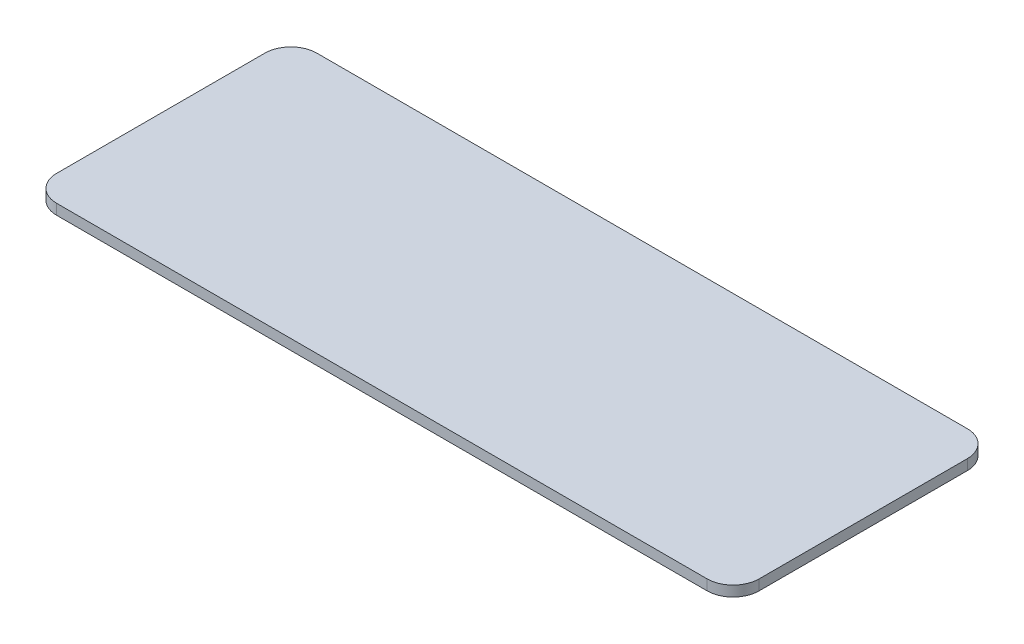
ISO-10303-21;
HEADER;
FILE_DESCRIPTION(('STEP AP214'),'2;1');
FILE_NAME('part.step','',(''),(''),'','','');
FILE_SCHEMA(('AUTOMOTIVE_DESIGN { 1 0 10303 214 1 1 1 1 }'));
ENDSEC;
DATA;
#1=APPLICATION_CONTEXT('core data for automotive mechanical design processes');
#2=APPLICATION_PROTOCOL_DEFINITION('international standard','automotive_design',2000,#1);
#3=PRODUCT_CONTEXT('',#1,'mechanical');
#4=PRODUCT('Part','Part','',(#3));
#5=PRODUCT_RELATED_PRODUCT_CATEGORY('part','',(#4));
#6=PRODUCT_DEFINITION_FORMATION('','',#4);
#7=PRODUCT_DEFINITION_CONTEXT('part definition',#1,'design');
#8=PRODUCT_DEFINITION('design','',#6,#7);
#9=PRODUCT_DEFINITION_SHAPE('','',#8);
#10=(LENGTH_UNIT() NAMED_UNIT(*) SI_UNIT(.MILLI.,.METRE.));
#11=(NAMED_UNIT(*) PLANE_ANGLE_UNIT() SI_UNIT($,.RADIAN.));
#12=(NAMED_UNIT(*) SI_UNIT($,.STERADIAN.) SOLID_ANGLE_UNIT());
#13=UNCERTAINTY_MEASURE_WITH_UNIT(LENGTH_MEASURE(1.E-05),#10,'distance_accuracy_value','');
#14=(GEOMETRIC_REPRESENTATION_CONTEXT(3) GLOBAL_UNCERTAINTY_ASSIGNED_CONTEXT((#13)) GLOBAL_UNIT_ASSIGNED_CONTEXT((#10,
#11,#12)) REPRESENTATION_CONTEXT('',''));
#15=CARTESIAN_POINT('',(0.,0.,0.));
#16=DIRECTION('',(0.,0.,1.));
#17=DIRECTION('',(1.,0.,0.));
#18=AXIS2_PLACEMENT_3D('',#15,#16,#17);
#19=CARTESIAN_POINT('',(50.,1.6,-16.));
#20=DIRECTION('',(0.,-1.,0.));
#21=DIRECTION('',(0.,0.,-1.));
#22=AXIS2_PLACEMENT_3D('',#19,#20,#21);
#23=CYLINDRICAL_SURFACE('',#22,4.);
#24=CARTESIAN_POINT('',(50.,0.,-16.));
#25=DIRECTION('',(0.,1.,0.));
#26=DIRECTION('',(0.,0.,-1.));
#27=AXIS2_PLACEMENT_3D('',#24,#25,#26);
#28=CIRCLE('',#27,4.);
#29=CARTESIAN_POINT('',(54.,0.,-16.));
#30=VERTEX_POINT('',#29);
#31=CARTESIAN_POINT('',(50.,0.,-20.));
#32=VERTEX_POINT('',#31);
#33=EDGE_CURVE('E129',#30,#32,#28,.T.);
#34=ORIENTED_EDGE('',*,*,#33,.T.);
#35=DIRECTION('',(0.,-1.,0.));
#36=VECTOR('',#35,1.);
#37=CARTESIAN_POINT('',(50.,1.6,-20.));
#38=LINE('',#37,#36);
#39=CARTESIAN_POINT('',(50.,1.6,-20.));
#40=VERTEX_POINT('',#39);
#41=EDGE_CURVE('E11',#40,#32,#38,.T.);
#42=ORIENTED_EDGE('',*,*,#41,.F.);
#43=CARTESIAN_POINT('',(50.,1.6,-16.));
#44=DIRECTION('',(0.,1.,0.));
#45=DIRECTION('',(0.,0.,-1.));
#46=AXIS2_PLACEMENT_3D('',#43,#44,#45);
#47=CIRCLE('',#46,4.);
#48=CARTESIAN_POINT('',(54.,1.6,-16.));
#49=VERTEX_POINT('',#48);
#50=EDGE_CURVE('E143',#49,#40,#47,.T.);
#51=ORIENTED_EDGE('',*,*,#50,.F.);
#52=DIRECTION('',(0.,-1.,0.));
#53=VECTOR('',#52,1.);
#54=CARTESIAN_POINT('',(54.,1.6,-16.));
#55=LINE('',#54,#53);
#56=EDGE_CURVE('E125',#49,#30,#55,.T.);
#57=ORIENTED_EDGE('',*,*,#56,.T.);
#58=EDGE_LOOP('',(#34,#42,#51,#57));
#59=FACE_BOUND('',#58,.T.);
#60=ADVANCED_FACE('F33',(#59),#23,.T.);
#61=CARTESIAN_POINT('',(-50.,1.6,-20.));
#62=DIRECTION('',(0.,0.,1.));
#63=DIRECTION('',(1.,0.,0.));
#64=AXIS2_PLACEMENT_3D('',#61,#62,#63);
#65=PLANE('',#64);
#66=DIRECTION('',(-1.,0.,0.));
#67=VECTOR('',#66,1.);
#68=CARTESIAN_POINT('',(-50.,0.,-20.));
#69=LINE('',#68,#67);
#70=CARTESIAN_POINT('',(-50.,0.,-20.));
#71=VERTEX_POINT('',#70);
#72=EDGE_CURVE('E132',#32,#71,#69,.T.);
#73=ORIENTED_EDGE('',*,*,#72,.T.);
#74=DIRECTION('',(0.,-1.,0.));
#75=VECTOR('',#74,1.);
#76=CARTESIAN_POINT('',(-50.,1.6,-20.));
#77=LINE('',#76,#75);
#78=CARTESIAN_POINT('',(-50.,1.6,-20.));
#79=VERTEX_POINT('',#78);
#80=EDGE_CURVE('E41',#79,#71,#77,.T.);
#81=ORIENTED_EDGE('',*,*,#80,.F.);
#82=DIRECTION('',(-1.,0.,0.));
#83=VECTOR('',#82,1.);
#84=CARTESIAN_POINT('',(-50.,1.6,-20.));
#85=LINE('',#84,#83);
#86=EDGE_CURVE('E92',#40,#79,#85,.T.);
#87=ORIENTED_EDGE('',*,*,#86,.F.);
#88=ORIENTED_EDGE('',*,*,#41,.T.);
#89=EDGE_LOOP('',(#73,#81,#87,#88));
#90=FACE_BOUND('',#89,.T.);
#91=ADVANCED_FACE('F178',(#90),#65,.F.);
#92=CARTESIAN_POINT('',(-50.,1.6,-16.));
#93=DIRECTION('',(0.,-1.,0.));
#94=DIRECTION('',(0.,0.,-1.));
#95=AXIS2_PLACEMENT_3D('',#92,#93,#94);
#96=CYLINDRICAL_SURFACE('',#95,4.);
#97=CARTESIAN_POINT('',(-50.,0.,-16.));
#98=DIRECTION('',(0.,1.,0.));
#99=DIRECTION('',(0.,0.,1.));
#100=AXIS2_PLACEMENT_3D('',#97,#98,#99);
#101=CIRCLE('',#100,4.);
#102=CARTESIAN_POINT('',(-54.,0.,-16.));
#103=VERTEX_POINT('',#102);
#104=EDGE_CURVE('E134',#71,#103,#101,.T.);
#105=ORIENTED_EDGE('',*,*,#104,.T.);
#106=DIRECTION('',(0.,-1.,0.));
#107=VECTOR('',#106,1.);
#108=CARTESIAN_POINT('',(-54.,1.6,-16.));
#109=LINE('',#108,#107);
#110=CARTESIAN_POINT('',(-54.,1.6,-16.));
#111=VERTEX_POINT('',#110);
#112=EDGE_CURVE('E150',#111,#103,#109,.T.);
#113=ORIENTED_EDGE('',*,*,#112,.F.);
#114=CARTESIAN_POINT('',(-50.,1.6,-16.));
#115=DIRECTION('',(0.,1.,0.));
#116=DIRECTION('',(0.,0.,1.));
#117=AXIS2_PLACEMENT_3D('',#114,#115,#116);
#118=CIRCLE('',#117,4.);
#119=EDGE_CURVE('E158',#79,#111,#118,.T.);
#120=ORIENTED_EDGE('',*,*,#119,.F.);
#121=ORIENTED_EDGE('',*,*,#80,.T.);
#122=EDGE_LOOP('',(#105,#113,#120,#121));
#123=FACE_BOUND('',#122,.T.);
#124=ADVANCED_FACE('F156',(#123),#96,.T.);
#125=CARTESIAN_POINT('',(-54.,1.6,-16.));
#126=DIRECTION('',(1.,0.,0.));
#127=DIRECTION('',(0.,0.,-1.));
#128=AXIS2_PLACEMENT_3D('',#125,#126,#127);
#129=PLANE('',#128);
#130=DIRECTION('',(0.,0.,1.));
#131=VECTOR('',#130,1.);
#132=CARTESIAN_POINT('',(-54.,0.,-16.));
#133=LINE('',#132,#131);
#134=CARTESIAN_POINT('',(-54.,0.,16.));
#135=VERTEX_POINT('',#134);
#136=EDGE_CURVE('E136',#103,#135,#133,.T.);
#137=ORIENTED_EDGE('',*,*,#136,.T.);
#138=DIRECTION('',(0.,-1.,0.));
#139=VECTOR('',#138,1.);
#140=CARTESIAN_POINT('',(-54.,1.6,16.));
#141=LINE('',#140,#139);
#142=CARTESIAN_POINT('',(-54.,1.6,16.));
#143=VERTEX_POINT('',#142);
#144=EDGE_CURVE('E147',#143,#135,#141,.T.);
#145=ORIENTED_EDGE('',*,*,#144,.F.);
#146=DIRECTION('',(0.,0.,1.));
#147=VECTOR('',#146,1.);
#148=CARTESIAN_POINT('',(-54.,1.6,-16.));
#149=LINE('',#148,#147);
#150=EDGE_CURVE('E170',#111,#143,#149,.T.);
#151=ORIENTED_EDGE('',*,*,#150,.F.);
#152=ORIENTED_EDGE('',*,*,#112,.T.);
#153=EDGE_LOOP('',(#137,#145,#151,#152));
#154=FACE_BOUND('',#153,.T.);
#155=ADVANCED_FACE('F166',(#154),#129,.F.);
#156=CARTESIAN_POINT('',(-50.,1.6,16.));
#157=DIRECTION('',(0.,-1.,0.));
#158=DIRECTION('',(0.,0.,-1.));
#159=AXIS2_PLACEMENT_3D('',#156,#157,#158);
#160=CYLINDRICAL_SURFACE('',#159,4.);
#161=CARTESIAN_POINT('',(-50.,0.,16.));
#162=DIRECTION('',(0.,1.,0.));
#163=DIRECTION('',(0.,0.,1.));
#164=AXIS2_PLACEMENT_3D('',#161,#162,#163);
#165=CIRCLE('',#164,4.);
#166=CARTESIAN_POINT('',(-50.,0.,20.));
#167=VERTEX_POINT('',#166);
#168=EDGE_CURVE('E138',#135,#167,#165,.T.);
#169=ORIENTED_EDGE('',*,*,#168,.T.);
#170=DIRECTION('',(0.,-1.,0.));
#171=VECTOR('',#170,1.);
#172=CARTESIAN_POINT('',(-50.,1.6,20.));
#173=LINE('',#172,#171);
#174=CARTESIAN_POINT('',(-50.,1.6,20.));
#175=VERTEX_POINT('',#174);
#176=EDGE_CURVE('E120',#175,#167,#173,.T.);
#177=ORIENTED_EDGE('',*,*,#176,.F.);
#178=CARTESIAN_POINT('',(-50.,1.6,16.));
#179=DIRECTION('',(0.,1.,0.));
#180=DIRECTION('',(0.,0.,1.));
#181=AXIS2_PLACEMENT_3D('',#178,#179,#180);
#182=CIRCLE('',#181,4.);
#183=EDGE_CURVE('E111',#143,#175,#182,.T.);
#184=ORIENTED_EDGE('',*,*,#183,.F.);
#185=ORIENTED_EDGE('',*,*,#144,.T.);
#186=EDGE_LOOP('',(#169,#177,#184,#185));
#187=FACE_BOUND('',#186,.T.);
#188=ADVANCED_FACE('F169',(#187),#160,.T.);
#189=CARTESIAN_POINT('',(-50.,1.6,20.));
#190=DIRECTION('',(0.,0.,-1.));
#191=DIRECTION('',(-1.,0.,0.));
#192=AXIS2_PLACEMENT_3D('',#189,#190,#191);
#193=PLANE('',#192);
#194=DIRECTION('',(1.,0.,0.));
#195=VECTOR('',#194,1.);
#196=CARTESIAN_POINT('',(-50.,0.,20.));
#197=LINE('',#196,#195);
#198=CARTESIAN_POINT('',(50.,0.,20.));
#199=VERTEX_POINT('',#198);
#200=EDGE_CURVE('E119',#167,#199,#197,.T.);
#201=ORIENTED_EDGE('',*,*,#200,.T.);
#202=DIRECTION('',(0.,-1.,0.));
#203=VECTOR('',#202,1.);
#204=CARTESIAN_POINT('',(50.,1.6,20.));
#205=LINE('',#204,#203);
#206=CARTESIAN_POINT('',(50.,1.6,20.));
#207=VERTEX_POINT('',#206);
#208=EDGE_CURVE('E116',#207,#199,#205,.T.);
#209=ORIENTED_EDGE('',*,*,#208,.F.);
#210=DIRECTION('',(1.,0.,0.));
#211=VECTOR('',#210,1.);
#212=CARTESIAN_POINT('',(-50.,1.6,20.));
#213=LINE('',#212,#211);
#214=EDGE_CURVE('E105',#175,#207,#213,.T.);
#215=ORIENTED_EDGE('',*,*,#214,.F.);
#216=ORIENTED_EDGE('',*,*,#176,.T.);
#217=EDGE_LOOP('',(#201,#209,#215,#216));
#218=FACE_BOUND('',#217,.T.);
#219=ADVANCED_FACE('F117',(#218),#193,.F.);
#220=CARTESIAN_POINT('',(50.,1.6,16.));
#221=DIRECTION('',(0.,-1.,0.));
#222=DIRECTION('',(0.,0.,-1.));
#223=AXIS2_PLACEMENT_3D('',#220,#221,#222);
#224=CYLINDRICAL_SURFACE('',#223,4.);
#225=CARTESIAN_POINT('',(50.,0.,16.));
#226=DIRECTION('',(0.,1.,0.));
#227=DIRECTION('',(0.,0.,1.));
#228=AXIS2_PLACEMENT_3D('',#225,#226,#227);
#229=CIRCLE('',#228,4.);
#230=CARTESIAN_POINT('',(54.,0.,16.));
#231=VERTEX_POINT('',#230);
#232=EDGE_CURVE('E78',#199,#231,#229,.T.);
#233=ORIENTED_EDGE('',*,*,#232,.T.);
#234=DIRECTION('',(0.,-1.,0.));
#235=VECTOR('',#234,1.);
#236=CARTESIAN_POINT('',(54.,1.6,16.));
#237=LINE('',#236,#235);
#238=CARTESIAN_POINT('',(54.,1.6,16.));
#239=VERTEX_POINT('',#238);
#240=EDGE_CURVE('E121',#239,#231,#237,.T.);
#241=ORIENTED_EDGE('',*,*,#240,.F.);
#242=CARTESIAN_POINT('',(50.,1.6,16.));
#243=DIRECTION('',(0.,1.,0.));
#244=DIRECTION('',(0.,0.,1.));
#245=AXIS2_PLACEMENT_3D('',#242,#243,#244);
#246=CIRCLE('',#245,4.);
#247=EDGE_CURVE('E109',#207,#239,#246,.T.);
#248=ORIENTED_EDGE('',*,*,#247,.F.);
#249=ORIENTED_EDGE('',*,*,#208,.T.);
#250=EDGE_LOOP('',(#233,#241,#248,#249));
#251=FACE_BOUND('',#250,.T.);
#252=ADVANCED_FACE('F123',(#251),#224,.T.);
#253=CARTESIAN_POINT('',(54.,1.6,-16.));
#254=DIRECTION('',(-1.,0.,0.));
#255=DIRECTION('',(0.,0.,1.));
#256=AXIS2_PLACEMENT_3D('',#253,#254,#255);
#257=PLANE('',#256);
#258=DIRECTION('',(0.,0.,-1.));
#259=VECTOR('',#258,1.);
#260=CARTESIAN_POINT('',(54.,0.,-16.));
#261=LINE('',#260,#259);
#262=EDGE_CURVE('E84',#231,#30,#261,.T.);
#263=ORIENTED_EDGE('',*,*,#262,.T.);
#264=ORIENTED_EDGE('',*,*,#56,.F.);
#265=DIRECTION('',(0.,0.,-1.));
#266=VECTOR('',#265,1.);
#267=CARTESIAN_POINT('',(54.,1.6,-16.));
#268=LINE('',#267,#266);
#269=EDGE_CURVE('E49',#239,#49,#268,.T.);
#270=ORIENTED_EDGE('',*,*,#269,.F.);
#271=ORIENTED_EDGE('',*,*,#240,.T.);
#272=EDGE_LOOP('',(#263,#264,#270,#271));
#273=FACE_BOUND('',#272,.T.);
#274=ADVANCED_FACE('F194',(#273),#257,.F.);
#275=CARTESIAN_POINT('',(50.,1.6,-16.));
#276=DIRECTION('',(0.,-1.,0.));
#277=DIRECTION('',(0.,0.,-1.));
#278=AXIS2_PLACEMENT_3D('',#275,#276,#277);
#279=PLANE('',#278);
#280=ORIENTED_EDGE('',*,*,#50,.T.);
#281=ORIENTED_EDGE('',*,*,#86,.T.);
#282=ORIENTED_EDGE('',*,*,#119,.T.);
#283=ORIENTED_EDGE('',*,*,#150,.T.);
#284=ORIENTED_EDGE('',*,*,#183,.T.);
#285=ORIENTED_EDGE('',*,*,#214,.T.);
#286=ORIENTED_EDGE('',*,*,#247,.T.);
#287=ORIENTED_EDGE('',*,*,#269,.T.);
#288=EDGE_LOOP('',(#280,#281,#282,#283,#284,#285,#286,#287));
#289=FACE_BOUND('',#288,.T.);
#290=ADVANCED_FACE('F107',(#289),#279,.F.);
#291=CARTESIAN_POINT('',(50.,0.,-16.));
#292=DIRECTION('',(0.,-1.,0.));
#293=DIRECTION('',(0.,0.,-1.));
#294=AXIS2_PLACEMENT_3D('',#291,#292,#293);
#295=PLANE('',#294);
#296=ORIENTED_EDGE('',*,*,#33,.F.);
#297=ORIENTED_EDGE('',*,*,#262,.F.);
#298=ORIENTED_EDGE('',*,*,#232,.F.);
#299=ORIENTED_EDGE('',*,*,#200,.F.);
#300=ORIENTED_EDGE('',*,*,#168,.F.);
#301=ORIENTED_EDGE('',*,*,#136,.F.);
#302=ORIENTED_EDGE('',*,*,#104,.F.);
#303=ORIENTED_EDGE('',*,*,#72,.F.);
#304=EDGE_LOOP('',(#296,#297,#298,#299,#300,#301,#302,#303));
#305=FACE_BOUND('',#304,.T.);
#306=ADVANCED_FACE('F162',(#305),#295,.T.);
#307=CLOSED_SHELL('',(#60,#91,#124,#155,#188,#219,#252,#274,#290,#306));
#308=MANIFOLD_SOLID_BREP('B2',#307);
#309=ADVANCED_BREP_SHAPE_REPRESENTATION('',(#18,#308),#14);
#310=SHAPE_DEFINITION_REPRESENTATION(#9,#309);
ENDSEC;
END-ISO-10303-21;
